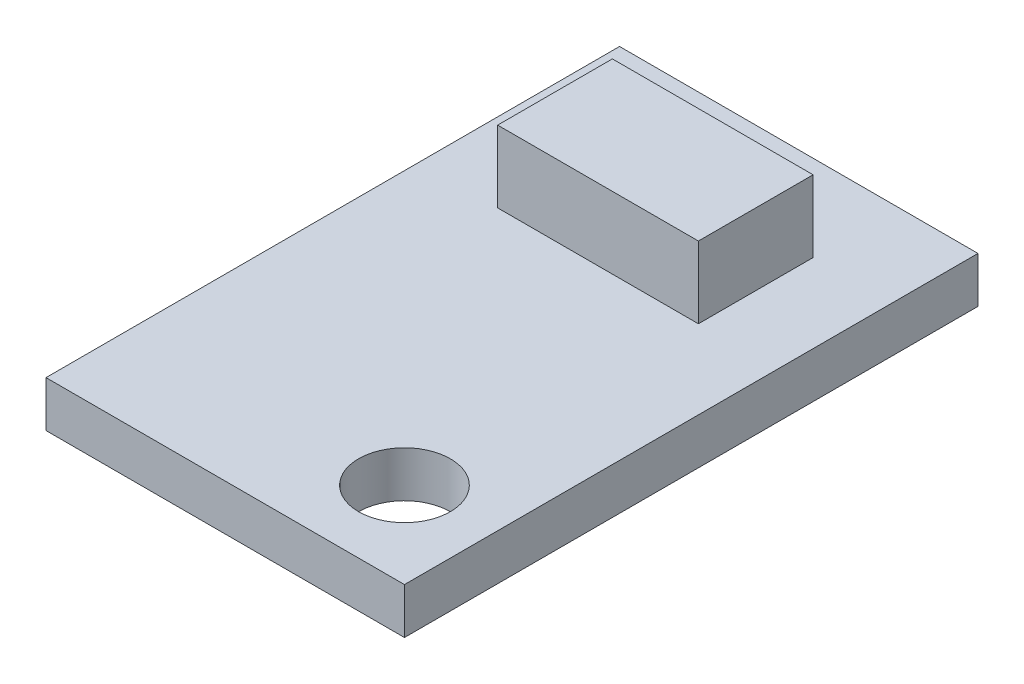
ISO-10303-21;
HEADER;
FILE_DESCRIPTION(('STEP AP214'),'2;1');
FILE_NAME('part.step','',(''),(''),'','','');
FILE_SCHEMA(('AUTOMOTIVE_DESIGN { 1 0 10303 214 1 1 1 1 }'));
ENDSEC;
DATA;
#1=APPLICATION_CONTEXT('core data for automotive mechanical design processes');
#2=APPLICATION_PROTOCOL_DEFINITION('international standard','automotive_design',2000,#1);
#3=PRODUCT_CONTEXT('',#1,'mechanical');
#4=PRODUCT('Part','Part','',(#3));
#5=PRODUCT_RELATED_PRODUCT_CATEGORY('part','',(#4));
#6=PRODUCT_DEFINITION_FORMATION('','',#4);
#7=PRODUCT_DEFINITION_CONTEXT('part definition',#1,'design');
#8=PRODUCT_DEFINITION('design','',#6,#7);
#9=PRODUCT_DEFINITION_SHAPE('','',#8);
#10=(LENGTH_UNIT() NAMED_UNIT(*) SI_UNIT(.MILLI.,.METRE.));
#11=(NAMED_UNIT(*) PLANE_ANGLE_UNIT() SI_UNIT($,.RADIAN.));
#12=(NAMED_UNIT(*) SI_UNIT($,.STERADIAN.) SOLID_ANGLE_UNIT());
#13=UNCERTAINTY_MEASURE_WITH_UNIT(LENGTH_MEASURE(1.E-05),#10,'distance_accuracy_value','');
#14=(GEOMETRIC_REPRESENTATION_CONTEXT(3) GLOBAL_UNCERTAINTY_ASSIGNED_CONTEXT((#13)) GLOBAL_UNIT_ASSIGNED_CONTEXT((#10,
#11,#12)) REPRESENTATION_CONTEXT('',''));
#15=CARTESIAN_POINT('',(0.,0.,0.));
#16=DIRECTION('',(0.,0.,1.));
#17=DIRECTION('',(1.,0.,0.));
#18=AXIS2_PLACEMENT_3D('',#15,#16,#17);
#19=CARTESIAN_POINT('',(0.,1.6,0.));
#20=DIRECTION('',(0.,-1.,0.));
#21=DIRECTION('',(0.,0.,-1.));
#22=AXIS2_PLACEMENT_3D('',#19,#20,#21);
#23=PLANE('',#22);
#24=CARTESIAN_POINT('',(3.25,1.6,-3.));
#25=DIRECTION('',(0.,1.,0.));
#26=DIRECTION('',(0.,0.,1.));
#27=AXIS2_PLACEMENT_3D('',#24,#25,#26);
#28=CIRCLE('',#27,1.6);
#29=CARTESIAN_POINT('',(3.25,1.6,-1.4));
#30=VERTEX_POINT('',#29);
#31=EDGE_CURVE('E123',#30,#30,#28,.T.);
#32=ORIENTED_EDGE('',*,*,#31,.F.);
#33=EDGE_LOOP('',(#32));
#34=FACE_BOUND('',#33,.T.);
#35=DIRECTION('',(0.,0.,1.));
#36=VECTOR('',#35,1.);
#37=CARTESIAN_POINT('',(-6.25,1.6,0.));
#38=LINE('',#37,#36);
#39=CARTESIAN_POINT('',(-6.25,1.6,-20.));
#40=VERTEX_POINT('',#39);
#41=CARTESIAN_POINT('',(-6.25,1.6,0.));
#42=VERTEX_POINT('',#41);
#43=EDGE_CURVE('E132',#40,#42,#38,.T.);
#44=ORIENTED_EDGE('',*,*,#43,.T.);
#45=DIRECTION('',(1.,0.,0.));
#46=VECTOR('',#45,1.);
#47=CARTESIAN_POINT('',(-6.25,1.6,0.));
#48=LINE('',#47,#46);
#49=CARTESIAN_POINT('',(6.25,1.6,0.));
#50=VERTEX_POINT('',#49);
#51=EDGE_CURVE('E135',#42,#50,#48,.T.);
#52=ORIENTED_EDGE('',*,*,#51,.T.);
#53=DIRECTION('',(0.,0.,-1.));
#54=VECTOR('',#53,1.);
#55=CARTESIAN_POINT('',(6.25,1.6,0.));
#56=LINE('',#55,#54);
#57=CARTESIAN_POINT('',(6.24999999999999,1.6,-20.));
#58=VERTEX_POINT('',#57);
#59=EDGE_CURVE('E138',#50,#58,#56,.T.);
#60=ORIENTED_EDGE('',*,*,#59,.T.);
#61=DIRECTION('',(-1.,0.,0.));
#62=VECTOR('',#61,1.);
#63=CARTESIAN_POINT('',(-6.25,1.6,-20.));
#64=LINE('',#63,#62);
#65=EDGE_CURVE('E140',#58,#40,#64,.T.);
#66=ORIENTED_EDGE('',*,*,#65,.T.);
#67=EDGE_LOOP('',(#44,#52,#60,#66));
#68=FACE_BOUND('',#67,.T.);
#69=DIRECTION('',(0.,0.,1.));
#70=VECTOR('',#69,1.);
#71=CARTESIAN_POINT('',(-3.5,1.6,-17.));
#72=LINE('',#71,#70);
#73=CARTESIAN_POINT('',(-3.5,1.6,-17.));
#74=VERTEX_POINT('',#73);
#75=CARTESIAN_POINT('',(-3.5,1.6,-13.));
#76=VERTEX_POINT('',#75);
#77=EDGE_CURVE('E119',#74,#76,#72,.T.);
#78=ORIENTED_EDGE('',*,*,#77,.F.);
#79=DIRECTION('',(-1.,0.,0.));
#80=VECTOR('',#79,1.);
#81=CARTESIAN_POINT('',(-3.5,1.6,-17.));
#82=LINE('',#81,#80);
#83=CARTESIAN_POINT('',(3.5,1.6,-17.));
#84=VERTEX_POINT('',#83);
#85=EDGE_CURVE('E116',#84,#74,#82,.T.);
#86=ORIENTED_EDGE('',*,*,#85,.F.);
#87=DIRECTION('',(0.,0.,-1.));
#88=VECTOR('',#87,1.);
#89=CARTESIAN_POINT('',(3.5,1.6,-17.));
#90=LINE('',#89,#88);
#91=CARTESIAN_POINT('',(3.5,1.6,-13.));
#92=VERTEX_POINT('',#91);
#93=EDGE_CURVE('E54',#92,#84,#90,.T.);
#94=ORIENTED_EDGE('',*,*,#93,.F.);
#95=DIRECTION('',(1.,0.,0.));
#96=VECTOR('',#95,1.);
#97=CARTESIAN_POINT('',(-3.5,1.6,-13.));
#98=LINE('',#97,#96);
#99=EDGE_CURVE('E49',#76,#92,#98,.T.);
#100=ORIENTED_EDGE('',*,*,#99,.F.);
#101=EDGE_LOOP('',(#78,#86,#94,#100));
#102=FACE_BOUND('',#101,.T.);
#103=ADVANCED_FACE('F34',(#34,#68,#102),#23,.F.);
#104=CARTESIAN_POINT('',(0.,0.,0.));
#105=DIRECTION('',(0.,-1.,0.));
#106=DIRECTION('',(0.,0.,-1.));
#107=AXIS2_PLACEMENT_3D('',#104,#105,#106);
#108=PLANE('',#107);
#109=DIRECTION('',(0.,0.,1.));
#110=VECTOR('',#109,1.);
#111=CARTESIAN_POINT('',(-6.25,0.,0.));
#112=LINE('',#111,#110);
#113=CARTESIAN_POINT('',(-6.25,0.,-20.));
#114=VERTEX_POINT('',#113);
#115=CARTESIAN_POINT('',(-6.25,0.,0.));
#116=VERTEX_POINT('',#115);
#117=EDGE_CURVE('E130',#114,#116,#112,.T.);
#118=ORIENTED_EDGE('',*,*,#117,.F.);
#119=DIRECTION('',(-1.,0.,0.));
#120=VECTOR('',#119,1.);
#121=CARTESIAN_POINT('',(-6.25,0.,-20.));
#122=LINE('',#121,#120);
#123=CARTESIAN_POINT('',(6.24999999999999,0.,-20.));
#124=VERTEX_POINT('',#123);
#125=EDGE_CURVE('E136',#124,#114,#122,.T.);
#126=ORIENTED_EDGE('',*,*,#125,.F.);
#127=DIRECTION('',(0.,0.,-1.));
#128=VECTOR('',#127,1.);
#129=CARTESIAN_POINT('',(6.25,0.,0.));
#130=LINE('',#129,#128);
#131=CARTESIAN_POINT('',(6.25,0.,0.));
#132=VERTEX_POINT('',#131);
#133=EDGE_CURVE('E147',#132,#124,#130,.T.);
#134=ORIENTED_EDGE('',*,*,#133,.F.);
#135=DIRECTION('',(1.,0.,0.));
#136=VECTOR('',#135,1.);
#137=CARTESIAN_POINT('',(-6.25,0.,0.));
#138=LINE('',#137,#136);
#139=EDGE_CURVE('E145',#116,#132,#138,.T.);
#140=ORIENTED_EDGE('',*,*,#139,.F.);
#141=EDGE_LOOP('',(#118,#126,#134,#140));
#142=FACE_BOUND('',#141,.T.);
#143=CARTESIAN_POINT('',(3.25,0.,-3.));
#144=DIRECTION('',(0.,1.,0.));
#145=DIRECTION('',(0.,0.,1.));
#146=AXIS2_PLACEMENT_3D('',#143,#144,#145);
#147=CIRCLE('',#146,1.6);
#148=CARTESIAN_POINT('',(3.25,0.,-1.4));
#149=VERTEX_POINT('',#148);
#150=EDGE_CURVE('E120',#149,#149,#147,.T.);
#151=ORIENTED_EDGE('',*,*,#150,.T.);
#152=EDGE_LOOP('',(#151));
#153=FACE_BOUND('',#152,.T.);
#154=ADVANCED_FACE('F165',(#142,#153),#108,.T.);
#155=CARTESIAN_POINT('',(-6.25,1.6,0.));
#156=DIRECTION('',(1.,0.,0.));
#157=DIRECTION('',(0.,0.,-1.));
#158=AXIS2_PLACEMENT_3D('',#155,#156,#157);
#159=PLANE('',#158);
#160=ORIENTED_EDGE('',*,*,#117,.T.);
#161=DIRECTION('',(0.,-1.,0.));
#162=VECTOR('',#161,1.);
#163=CARTESIAN_POINT('',(-6.25,1.6,0.));
#164=LINE('',#163,#162);
#165=EDGE_CURVE('E11',#42,#116,#164,.T.);
#166=ORIENTED_EDGE('',*,*,#165,.F.);
#167=ORIENTED_EDGE('',*,*,#43,.F.);
#168=DIRECTION('',(0.,-1.,0.));
#169=VECTOR('',#168,1.);
#170=CARTESIAN_POINT('',(-6.25,1.6,-20.));
#171=LINE('',#170,#169);
#172=EDGE_CURVE('E142',#40,#114,#171,.T.);
#173=ORIENTED_EDGE('',*,*,#172,.T.);
#174=EDGE_LOOP('',(#160,#166,#167,#173));
#175=FACE_BOUND('',#174,.T.);
#176=ADVANCED_FACE('F36',(#175),#159,.F.);
#177=CARTESIAN_POINT('',(-6.25,1.6,0.));
#178=DIRECTION('',(0.,0.,-1.));
#179=DIRECTION('',(-1.,0.,0.));
#180=AXIS2_PLACEMENT_3D('',#177,#178,#179);
#181=PLANE('',#180);
#182=ORIENTED_EDGE('',*,*,#139,.T.);
#183=DIRECTION('',(0.,-1.,0.));
#184=VECTOR('',#183,1.);
#185=CARTESIAN_POINT('',(6.25,1.6,0.));
#186=LINE('',#185,#184);
#187=EDGE_CURVE('E42',#50,#132,#186,.T.);
#188=ORIENTED_EDGE('',*,*,#187,.F.);
#189=ORIENTED_EDGE('',*,*,#51,.F.);
#190=ORIENTED_EDGE('',*,*,#165,.T.);
#191=EDGE_LOOP('',(#182,#188,#189,#190));
#192=FACE_BOUND('',#191,.T.);
#193=ADVANCED_FACE('F175',(#192),#181,.F.);
#194=CARTESIAN_POINT('',(6.25,1.6,0.));
#195=DIRECTION('',(-1.,0.,0.));
#196=DIRECTION('',(0.,0.,1.));
#197=AXIS2_PLACEMENT_3D('',#194,#195,#196);
#198=PLANE('',#197);
#199=ORIENTED_EDGE('',*,*,#133,.T.);
#200=DIRECTION('',(0.,-1.,0.));
#201=VECTOR('',#200,1.);
#202=CARTESIAN_POINT('',(6.24999999999999,1.6,-20.));
#203=LINE('',#202,#201);
#204=EDGE_CURVE('E152',#58,#124,#203,.T.);
#205=ORIENTED_EDGE('',*,*,#204,.F.);
#206=ORIENTED_EDGE('',*,*,#59,.F.);
#207=ORIENTED_EDGE('',*,*,#187,.T.);
#208=EDGE_LOOP('',(#199,#205,#206,#207));
#209=FACE_BOUND('',#208,.T.);
#210=ADVANCED_FACE('F159',(#209),#198,.F.);
#211=CARTESIAN_POINT('',(-6.25,1.6,-20.));
#212=DIRECTION('',(0.,0.,1.));
#213=DIRECTION('',(1.,0.,0.));
#214=AXIS2_PLACEMENT_3D('',#211,#212,#213);
#215=PLANE('',#214);
#216=ORIENTED_EDGE('',*,*,#125,.T.);
#217=ORIENTED_EDGE('',*,*,#172,.F.);
#218=ORIENTED_EDGE('',*,*,#65,.F.);
#219=ORIENTED_EDGE('',*,*,#204,.T.);
#220=EDGE_LOOP('',(#216,#217,#218,#219));
#221=FACE_BOUND('',#220,.T.);
#222=ADVANCED_FACE('F169',(#221),#215,.F.);
#223=CARTESIAN_POINT('',(3.25,1.6,-3.));
#224=DIRECTION('',(0.,-1.,0.));
#225=DIRECTION('',(0.,0.,-1.));
#226=AXIS2_PLACEMENT_3D('',#223,#224,#225);
#227=CYLINDRICAL_SURFACE('',#226,1.6);
#228=ORIENTED_EDGE('',*,*,#31,.T.);
#229=EDGE_LOOP('',(#228));
#230=FACE_BOUND('',#229,.T.);
#231=ORIENTED_EDGE('',*,*,#150,.F.);
#232=EDGE_LOOP('',(#231));
#233=FACE_BOUND('',#232,.T.);
#234=ADVANCED_FACE('F191',(#230,#233),#227,.F.);
#235=CARTESIAN_POINT('',(-3.5,4.1,-17.));
#236=DIRECTION('',(1.,0.,0.));
#237=DIRECTION('',(0.,0.,-1.));
#238=AXIS2_PLACEMENT_3D('',#235,#236,#237);
#239=PLANE('',#238);
#240=ORIENTED_EDGE('',*,*,#77,.T.);
#241=DIRECTION('',(0.,-1.,0.));
#242=VECTOR('',#241,1.);
#243=CARTESIAN_POINT('',(-3.5,4.1,-13.));
#244=LINE('',#243,#242);
#245=CARTESIAN_POINT('',(-3.5,4.1,-13.));
#246=VERTEX_POINT('',#245);
#247=EDGE_CURVE('E100',#246,#76,#244,.T.);
#248=ORIENTED_EDGE('',*,*,#247,.F.);
#249=DIRECTION('',(0.,0.,1.));
#250=VECTOR('',#249,1.);
#251=CARTESIAN_POINT('',(-3.5,4.1,-17.));
#252=LINE('',#251,#250);
#253=CARTESIAN_POINT('',(-3.5,4.1,-17.));
#254=VERTEX_POINT('',#253);
#255=EDGE_CURVE('E107',#254,#246,#252,.T.);
#256=ORIENTED_EDGE('',*,*,#255,.F.);
#257=DIRECTION('',(0.,-1.,0.));
#258=VECTOR('',#257,1.);
#259=CARTESIAN_POINT('',(-3.5,4.1,-17.));
#260=LINE('',#259,#258);
#261=EDGE_CURVE('E292',#254,#74,#260,.T.);
#262=ORIENTED_EDGE('',*,*,#261,.T.);
#263=EDGE_LOOP('',(#240,#248,#256,#262));
#264=FACE_BOUND('',#263,.T.);
#265=ADVANCED_FACE('F118',(#264),#239,.F.);
#266=CARTESIAN_POINT('',(-3.5,4.1,-13.));
#267=DIRECTION('',(0.,0.,-1.));
#268=DIRECTION('',(-1.,0.,0.));
#269=AXIS2_PLACEMENT_3D('',#266,#267,#268);
#270=PLANE('',#269);
#271=ORIENTED_EDGE('',*,*,#99,.T.);
#272=DIRECTION('',(0.,-1.,0.));
#273=VECTOR('',#272,1.);
#274=CARTESIAN_POINT('',(3.5,4.1,-13.));
#275=LINE('',#274,#273);
#276=CARTESIAN_POINT('',(3.5,4.1,-13.));
#277=VERTEX_POINT('',#276);
#278=EDGE_CURVE('E103',#277,#92,#275,.T.);
#279=ORIENTED_EDGE('',*,*,#278,.F.);
#280=DIRECTION('',(1.,0.,0.));
#281=VECTOR('',#280,1.);
#282=CARTESIAN_POINT('',(-3.5,4.1,-13.));
#283=LINE('',#282,#281);
#284=EDGE_CURVE('E96',#246,#277,#283,.T.);
#285=ORIENTED_EDGE('',*,*,#284,.F.);
#286=ORIENTED_EDGE('',*,*,#247,.T.);
#287=EDGE_LOOP('',(#271,#279,#285,#286));
#288=FACE_BOUND('',#287,.T.);
#289=ADVANCED_FACE('F98',(#288),#270,.F.);
#290=CARTESIAN_POINT('',(3.5,4.1,-17.));
#291=DIRECTION('',(-1.,0.,0.));
#292=DIRECTION('',(0.,0.,1.));
#293=AXIS2_PLACEMENT_3D('',#290,#291,#292);
#294=PLANE('',#293);
#295=ORIENTED_EDGE('',*,*,#93,.T.);
#296=DIRECTION('',(0.,-1.,0.));
#297=VECTOR('',#296,1.);
#298=CARTESIAN_POINT('',(3.5,4.1,-17.));
#299=LINE('',#298,#297);
#300=CARTESIAN_POINT('',(3.5,4.1,-17.));
#301=VERTEX_POINT('',#300);
#302=EDGE_CURVE('E125',#301,#84,#299,.T.);
#303=ORIENTED_EDGE('',*,*,#302,.F.);
#304=DIRECTION('',(0.,0.,-1.));
#305=VECTOR('',#304,1.);
#306=CARTESIAN_POINT('',(3.5,4.1,-17.));
#307=LINE('',#306,#305);
#308=EDGE_CURVE('E106',#277,#301,#307,.T.);
#309=ORIENTED_EDGE('',*,*,#308,.F.);
#310=ORIENTED_EDGE('',*,*,#278,.T.);
#311=EDGE_LOOP('',(#295,#303,#309,#310));
#312=FACE_BOUND('',#311,.T.);
#313=ADVANCED_FACE('F207',(#312),#294,.F.);
#314=CARTESIAN_POINT('',(-3.5,4.1,-17.));
#315=DIRECTION('',(0.,0.,1.));
#316=DIRECTION('',(1.,0.,0.));
#317=AXIS2_PLACEMENT_3D('',#314,#315,#316);
#318=PLANE('',#317);
#319=ORIENTED_EDGE('',*,*,#85,.T.);
#320=ORIENTED_EDGE('',*,*,#261,.F.);
#321=DIRECTION('',(-1.,0.,0.));
#322=VECTOR('',#321,1.);
#323=CARTESIAN_POINT('',(-3.5,4.1,-17.));
#324=LINE('',#323,#322);
#325=EDGE_CURVE('E112',#301,#254,#324,.T.);
#326=ORIENTED_EDGE('',*,*,#325,.F.);
#327=ORIENTED_EDGE('',*,*,#302,.T.);
#328=EDGE_LOOP('',(#319,#320,#326,#327));
#329=FACE_BOUND('',#328,.T.);
#330=ADVANCED_FACE('F212',(#329),#318,.F.);
#331=CARTESIAN_POINT('',(0.,4.1,0.));
#332=DIRECTION('',(0.,1.,0.));
#333=DIRECTION('',(0.,0.,1.));
#334=AXIS2_PLACEMENT_3D('',#331,#332,#333);
#335=PLANE('',#334);
#336=ORIENTED_EDGE('',*,*,#255,.T.);
#337=ORIENTED_EDGE('',*,*,#284,.T.);
#338=ORIENTED_EDGE('',*,*,#308,.T.);
#339=ORIENTED_EDGE('',*,*,#325,.T.);
#340=EDGE_LOOP('',(#336,#337,#338,#339));
#341=FACE_BOUND('',#340,.T.);
#342=ADVANCED_FACE('F110',(#341),#335,.T.);
#343=CLOSED_SHELL('',(#103,#154,#176,#193,#210,#222,#234,#265,#289,#313,#330,#342));
#344=MANIFOLD_SOLID_BREP('B2',#343);
#345=ADVANCED_BREP_SHAPE_REPRESENTATION('',(#18,#344),#14);
#346=SHAPE_DEFINITION_REPRESENTATION(#9,#345);
ENDSEC;
END-ISO-10303-21;
